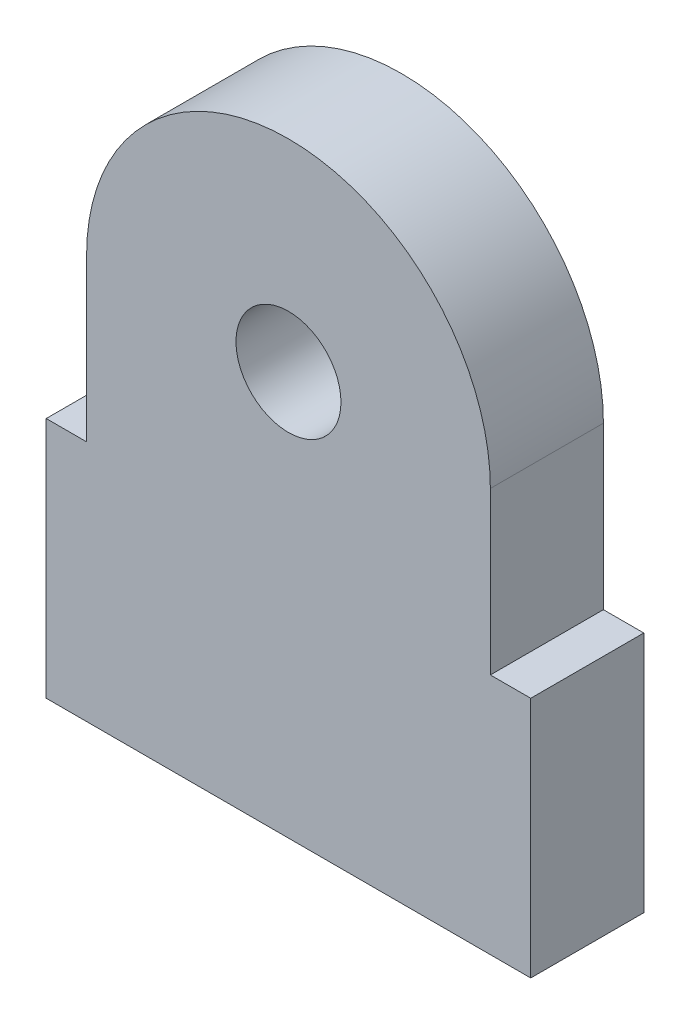
ISO-10303-21;
HEADER;
FILE_DESCRIPTION(('STEP AP214'),'2;1');
FILE_NAME('part.step','',(''),(''),'','','');
FILE_SCHEMA(('AUTOMOTIVE_DESIGN { 1 0 10303 214 1 1 1 1 }'));
ENDSEC;
DATA;
#1=APPLICATION_CONTEXT('core data for automotive mechanical design processes');
#2=APPLICATION_PROTOCOL_DEFINITION('international standard','automotive_design',2000,#1);
#3=PRODUCT_CONTEXT('',#1,'mechanical');
#4=PRODUCT('Part','Part','',(#3));
#5=PRODUCT_RELATED_PRODUCT_CATEGORY('part','',(#4));
#6=PRODUCT_DEFINITION_FORMATION('','',#4);
#7=PRODUCT_DEFINITION_CONTEXT('part definition',#1,'design');
#8=PRODUCT_DEFINITION('design','',#6,#7);
#9=PRODUCT_DEFINITION_SHAPE('','',#8);
#10=(LENGTH_UNIT() NAMED_UNIT(*) SI_UNIT(.MILLI.,.METRE.));
#11=(NAMED_UNIT(*) PLANE_ANGLE_UNIT() SI_UNIT($,.RADIAN.));
#12=(NAMED_UNIT(*) SI_UNIT($,.STERADIAN.) SOLID_ANGLE_UNIT());
#13=UNCERTAINTY_MEASURE_WITH_UNIT(LENGTH_MEASURE(1.E-05),#10,'distance_accuracy_value','');
#14=(GEOMETRIC_REPRESENTATION_CONTEXT(3) GLOBAL_UNCERTAINTY_ASSIGNED_CONTEXT((#13)) GLOBAL_UNIT_ASSIGNED_CONTEXT((#10,
#11,#12)) REPRESENTATION_CONTEXT('',''));
#15=CARTESIAN_POINT('',(0.,0.,0.));
#16=DIRECTION('',(0.,0.,1.));
#17=DIRECTION('',(1.,0.,0.));
#18=AXIS2_PLACEMENT_3D('',#15,#16,#17);
#19=CARTESIAN_POINT('',(-15.,-10.,7.));
#20=DIRECTION('',(0.,-1.,0.));
#21=DIRECTION('',(1.,0.,0.));
#22=AXIS2_PLACEMENT_3D('',#19,#20,#21);
#23=PLANE('',#22);
#24=DIRECTION('',(-1.,0.,0.));
#25=VECTOR('',#24,1.);
#26=CARTESIAN_POINT('',(-15.,-10.,0.));
#27=LINE('',#26,#25);
#28=CARTESIAN_POINT('',(-12.5,-10.,0.));
#29=VERTEX_POINT('',#28);
#30=CARTESIAN_POINT('',(-15.,-10.,0.));
#31=VERTEX_POINT('',#30);
#32=EDGE_CURVE('E129',#29,#31,#27,.T.);
#33=ORIENTED_EDGE('',*,*,#32,.T.);
#34=DIRECTION('',(0.,0.,-1.));
#35=VECTOR('',#34,1.);
#36=CARTESIAN_POINT('',(-15.,-10.,7.));
#37=LINE('',#36,#35);
#38=CARTESIAN_POINT('',(-15.,-10.,7.));
#39=VERTEX_POINT('',#38);
#40=EDGE_CURVE('E11',#39,#31,#37,.T.);
#41=ORIENTED_EDGE('',*,*,#40,.F.);
#42=DIRECTION('',(-1.,0.,0.));
#43=VECTOR('',#42,1.);
#44=CARTESIAN_POINT('',(-15.,-10.,7.));
#45=LINE('',#44,#43);
#46=CARTESIAN_POINT('',(-12.5,-10.,7.));
#47=VERTEX_POINT('',#46);
#48=EDGE_CURVE('E144',#47,#39,#45,.T.);
#49=ORIENTED_EDGE('',*,*,#48,.F.);
#50=DIRECTION('',(0.,0.,-1.));
#51=VECTOR('',#50,1.);
#52=CARTESIAN_POINT('',(-12.5,-10.,7.));
#53=LINE('',#52,#51);
#54=EDGE_CURVE('E125',#47,#29,#53,.T.);
#55=ORIENTED_EDGE('',*,*,#54,.T.);
#56=EDGE_LOOP('',(#33,#41,#49,#55));
#57=FACE_BOUND('',#56,.T.);
#58=ADVANCED_FACE('F33',(#57),#23,.F.);
#59=CARTESIAN_POINT('',(-15.,-10.,7.));
#60=DIRECTION('',(1.,0.,0.));
#61=DIRECTION('',(0.,1.,0.));
#62=AXIS2_PLACEMENT_3D('',#59,#60,#61);
#63=PLANE('',#62);
#64=DIRECTION('',(0.,-1.,0.));
#65=VECTOR('',#64,1.);
#66=CARTESIAN_POINT('',(-15.,-10.,0.));
#67=LINE('',#66,#65);
#68=CARTESIAN_POINT('',(-15.,-25.,0.));
#69=VERTEX_POINT('',#68);
#70=EDGE_CURVE('E132',#31,#69,#67,.T.);
#71=ORIENTED_EDGE('',*,*,#70,.T.);
#72=DIRECTION('',(0.,0.,-1.));
#73=VECTOR('',#72,1.);
#74=CARTESIAN_POINT('',(-15.,-25.,7.));
#75=LINE('',#74,#73);
#76=CARTESIAN_POINT('',(-15.,-25.,7.));
#77=VERTEX_POINT('',#76);
#78=EDGE_CURVE('E41',#77,#69,#75,.T.);
#79=ORIENTED_EDGE('',*,*,#78,.F.);
#80=DIRECTION('',(0.,-1.,0.));
#81=VECTOR('',#80,1.);
#82=CARTESIAN_POINT('',(-15.,-10.,7.));
#83=LINE('',#82,#81);
#84=EDGE_CURVE('E92',#39,#77,#83,.T.);
#85=ORIENTED_EDGE('',*,*,#84,.F.);
#86=ORIENTED_EDGE('',*,*,#40,.T.);
#87=EDGE_LOOP('',(#71,#79,#85,#86));
#88=FACE_BOUND('',#87,.T.);
#89=ADVANCED_FACE('F200',(#88),#63,.F.);
#90=CARTESIAN_POINT('',(-15.,-25.,7.));
#91=DIRECTION('',(0.,1.,0.));
#92=DIRECTION('',(0.,0.,1.));
#93=AXIS2_PLACEMENT_3D('',#90,#91,#92);
#94=PLANE('',#93);
#95=DIRECTION('',(1.,0.,0.));
#96=VECTOR('',#95,1.);
#97=CARTESIAN_POINT('',(-15.,-25.,0.));
#98=LINE('',#97,#96);
#99=CARTESIAN_POINT('',(15.,-25.,0.));
#100=VERTEX_POINT('',#99);
#101=EDGE_CURVE('E135',#69,#100,#98,.T.);
#102=ORIENTED_EDGE('',*,*,#101,.T.);
#103=DIRECTION('',(0.,0.,-1.));
#104=VECTOR('',#103,1.);
#105=CARTESIAN_POINT('',(15.,-25.,7.));
#106=LINE('',#105,#104);
#107=CARTESIAN_POINT('',(15.,-25.,7.));
#108=VERTEX_POINT('',#107);
#109=EDGE_CURVE('E151',#108,#100,#106,.T.);
#110=ORIENTED_EDGE('',*,*,#109,.F.);
#111=DIRECTION('',(1.,0.,0.));
#112=VECTOR('',#111,1.);
#113=CARTESIAN_POINT('',(-15.,-25.,7.));
#114=LINE('',#113,#112);
#115=EDGE_CURVE('E159',#77,#108,#114,.T.);
#116=ORIENTED_EDGE('',*,*,#115,.F.);
#117=ORIENTED_EDGE('',*,*,#78,.T.);
#118=EDGE_LOOP('',(#102,#110,#116,#117));
#119=FACE_BOUND('',#118,.T.);
#120=ADVANCED_FACE('F157',(#119),#94,.F.);
#121=CARTESIAN_POINT('',(15.,-10.,7.));
#122=DIRECTION('',(-1.,0.,0.));
#123=DIRECTION('',(0.,-1.,0.));
#124=AXIS2_PLACEMENT_3D('',#121,#122,#123);
#125=PLANE('',#124);
#126=DIRECTION('',(0.,1.,0.));
#127=VECTOR('',#126,1.);
#128=CARTESIAN_POINT('',(15.,-10.,0.));
#129=LINE('',#128,#127);
#130=CARTESIAN_POINT('',(15.,-10.,0.));
#131=VERTEX_POINT('',#130);
#132=EDGE_CURVE('E137',#100,#131,#129,.T.);
#133=ORIENTED_EDGE('',*,*,#132,.T.);
#134=DIRECTION('',(0.,0.,-1.));
#135=VECTOR('',#134,1.);
#136=CARTESIAN_POINT('',(15.,-10.,7.));
#137=LINE('',#136,#135);
#138=CARTESIAN_POINT('',(15.,-10.,7.));
#139=VERTEX_POINT('',#138);
#140=EDGE_CURVE('E148',#139,#131,#137,.T.);
#141=ORIENTED_EDGE('',*,*,#140,.F.);
#142=DIRECTION('',(0.,1.,0.));
#143=VECTOR('',#142,1.);
#144=CARTESIAN_POINT('',(15.,-10.,7.));
#145=LINE('',#144,#143);
#146=EDGE_CURVE('E171',#108,#139,#145,.T.);
#147=ORIENTED_EDGE('',*,*,#146,.F.);
#148=ORIENTED_EDGE('',*,*,#109,.T.);
#149=EDGE_LOOP('',(#133,#141,#147,#148));
#150=FACE_BOUND('',#149,.T.);
#151=ADVANCED_FACE('F167',(#150),#125,.F.);
#152=CARTESIAN_POINT('',(12.5,-10.,7.));
#153=DIRECTION('',(0.,-1.,0.));
#154=DIRECTION('',(1.,0.,0.));
#155=AXIS2_PLACEMENT_3D('',#152,#153,#154);
#156=PLANE('',#155);
#157=DIRECTION('',(-1.,0.,0.));
#158=VECTOR('',#157,1.);
#159=CARTESIAN_POINT('',(12.5,-10.,0.));
#160=LINE('',#159,#158);
#161=CARTESIAN_POINT('',(12.5,-10.,0.));
#162=VERTEX_POINT('',#161);
#163=EDGE_CURVE('E139',#131,#162,#160,.T.);
#164=ORIENTED_EDGE('',*,*,#163,.T.);
#165=DIRECTION('',(0.,0.,-1.));
#166=VECTOR('',#165,1.);
#167=CARTESIAN_POINT('',(12.5,-10.,7.));
#168=LINE('',#167,#166);
#169=CARTESIAN_POINT('',(12.5,-10.,7.));
#170=VERTEX_POINT('',#169);
#171=EDGE_CURVE('E120',#170,#162,#168,.T.);
#172=ORIENTED_EDGE('',*,*,#171,.F.);
#173=DIRECTION('',(-1.,0.,0.));
#174=VECTOR('',#173,1.);
#175=CARTESIAN_POINT('',(12.5,-10.,7.));
#176=LINE('',#175,#174);
#177=EDGE_CURVE('E111',#139,#170,#176,.T.);
#178=ORIENTED_EDGE('',*,*,#177,.F.);
#179=ORIENTED_EDGE('',*,*,#140,.T.);
#180=EDGE_LOOP('',(#164,#172,#178,#179));
#181=FACE_BOUND('',#180,.T.);
#182=ADVANCED_FACE('F170',(#181),#156,.F.);
#183=CARTESIAN_POINT('',(12.5,0.,7.));
#184=DIRECTION('',(-1.,0.,0.));
#185=DIRECTION('',(0.,0.,1.));
#186=AXIS2_PLACEMENT_3D('',#183,#184,#185);
#187=PLANE('',#186);
#188=DIRECTION('',(0.,1.,0.));
#189=VECTOR('',#188,1.);
#190=CARTESIAN_POINT('',(12.5,0.,0.));
#191=LINE('',#190,#189);
#192=CARTESIAN_POINT('',(12.5,0.,0.));
#193=VERTEX_POINT('',#192);
#194=EDGE_CURVE('E119',#162,#193,#191,.T.);
#195=ORIENTED_EDGE('',*,*,#194,.T.);
#196=DIRECTION('',(0.,0.,-1.));
#197=VECTOR('',#196,1.);
#198=CARTESIAN_POINT('',(12.5,0.,7.));
#199=LINE('',#198,#197);
#200=CARTESIAN_POINT('',(12.5,0.,7.));
#201=VERTEX_POINT('',#200);
#202=EDGE_CURVE('E116',#201,#193,#199,.T.);
#203=ORIENTED_EDGE('',*,*,#202,.F.);
#204=DIRECTION('',(0.,1.,0.));
#205=VECTOR('',#204,1.);
#206=CARTESIAN_POINT('',(12.5,0.,7.));
#207=LINE('',#206,#205);
#208=EDGE_CURVE('E105',#170,#201,#207,.T.);
#209=ORIENTED_EDGE('',*,*,#208,.F.);
#210=ORIENTED_EDGE('',*,*,#171,.T.);
#211=EDGE_LOOP('',(#195,#203,#209,#210));
#212=FACE_BOUND('',#211,.T.);
#213=ADVANCED_FACE('F117',(#212),#187,.F.);
#214=CARTESIAN_POINT('',(0.,0.,7.));
#215=DIRECTION('',(0.,0.,-1.));
#216=DIRECTION('',(-1.,0.,0.));
#217=AXIS2_PLACEMENT_3D('',#214,#215,#216);
#218=CYLINDRICAL_SURFACE('',#217,12.5);
#219=CARTESIAN_POINT('',(0.,0.,0.));
#220=DIRECTION('',(0.,0.,1.));
#221=DIRECTION('',(1.,0.,0.));
#222=AXIS2_PLACEMENT_3D('',#219,#220,#221);
#223=CIRCLE('',#222,12.5);
#224=CARTESIAN_POINT('',(-12.5,0.,0.));
#225=VERTEX_POINT('',#224);
#226=EDGE_CURVE('E78',#193,#225,#223,.T.);
#227=ORIENTED_EDGE('',*,*,#226,.T.);
#228=DIRECTION('',(0.,0.,-1.));
#229=VECTOR('',#228,1.);
#230=CARTESIAN_POINT('',(-12.5,0.,7.));
#231=LINE('',#230,#229);
#232=CARTESIAN_POINT('',(-12.5,0.,7.));
#233=VERTEX_POINT('',#232);
#234=EDGE_CURVE('E121',#233,#225,#231,.T.);
#235=ORIENTED_EDGE('',*,*,#234,.F.);
#236=CARTESIAN_POINT('',(0.,0.,7.));
#237=DIRECTION('',(0.,0.,1.));
#238=DIRECTION('',(1.,0.,0.));
#239=AXIS2_PLACEMENT_3D('',#236,#237,#238);
#240=CIRCLE('',#239,12.5);
#241=EDGE_CURVE('E109',#201,#233,#240,.T.);
#242=ORIENTED_EDGE('',*,*,#241,.F.);
#243=ORIENTED_EDGE('',*,*,#202,.T.);
#244=EDGE_LOOP('',(#227,#235,#242,#243));
#245=FACE_BOUND('',#244,.T.);
#246=ADVANCED_FACE('F123',(#245),#218,.T.);
#247=CARTESIAN_POINT('',(-12.5,0.,7.));
#248=DIRECTION('',(1.,0.,0.));
#249=DIRECTION('',(0.,0.,-1.));
#250=AXIS2_PLACEMENT_3D('',#247,#248,#249);
#251=PLANE('',#250);
#252=DIRECTION('',(0.,-1.,0.));
#253=VECTOR('',#252,1.);
#254=CARTESIAN_POINT('',(-12.5,0.,0.));
#255=LINE('',#254,#253);
#256=EDGE_CURVE('E84',#225,#29,#255,.T.);
#257=ORIENTED_EDGE('',*,*,#256,.T.);
#258=ORIENTED_EDGE('',*,*,#54,.F.);
#259=DIRECTION('',(0.,-1.,0.));
#260=VECTOR('',#259,1.);
#261=CARTESIAN_POINT('',(-12.5,0.,7.));
#262=LINE('',#261,#260);
#263=EDGE_CURVE('E49',#233,#47,#262,.T.);
#264=ORIENTED_EDGE('',*,*,#263,.F.);
#265=ORIENTED_EDGE('',*,*,#234,.T.);
#266=EDGE_LOOP('',(#257,#258,#264,#265));
#267=FACE_BOUND('',#266,.T.);
#268=ADVANCED_FACE('F191',(#267),#251,.F.);
#269=CARTESIAN_POINT('',(0.,0.,7.));
#270=DIRECTION('',(0.,0.,1.));
#271=DIRECTION('',(1.,0.,0.));
#272=AXIS2_PLACEMENT_3D('',#269,#270,#271);
#273=PLANE('',#272);
#274=CARTESIAN_POINT('',(0.,0.,7.));
#275=DIRECTION('',(0.,0.,1.));
#276=DIRECTION('',(1.,0.,0.));
#277=AXIS2_PLACEMENT_3D('',#274,#275,#276);
#278=CIRCLE('',#277,3.25);
#279=CARTESIAN_POINT('',(3.25,0.,7.));
#280=VERTEX_POINT('',#279);
#281=EDGE_CURVE('E177',#280,#280,#278,.T.);
#282=ORIENTED_EDGE('',*,*,#281,.F.);
#283=EDGE_LOOP('',(#282));
#284=FACE_BOUND('',#283,.T.);
#285=ORIENTED_EDGE('',*,*,#48,.T.);
#286=ORIENTED_EDGE('',*,*,#84,.T.);
#287=ORIENTED_EDGE('',*,*,#115,.T.);
#288=ORIENTED_EDGE('',*,*,#146,.T.);
#289=ORIENTED_EDGE('',*,*,#177,.T.);
#290=ORIENTED_EDGE('',*,*,#208,.T.);
#291=ORIENTED_EDGE('',*,*,#241,.T.);
#292=ORIENTED_EDGE('',*,*,#263,.T.);
#293=EDGE_LOOP('',(#285,#286,#287,#288,#289,#290,#291,#292));
#294=FACE_BOUND('',#293,.T.);
#295=ADVANCED_FACE('F107',(#284,#294),#273,.T.);
#296=CARTESIAN_POINT('',(0.,0.,0.));
#297=DIRECTION('',(0.,0.,1.));
#298=DIRECTION('',(1.,0.,0.));
#299=AXIS2_PLACEMENT_3D('',#296,#297,#298);
#300=PLANE('',#299);
#301=CARTESIAN_POINT('',(0.,0.,0.));
#302=DIRECTION('',(0.,0.,1.));
#303=DIRECTION('',(1.,0.,0.));
#304=AXIS2_PLACEMENT_3D('',#301,#302,#303);
#305=CIRCLE('',#304,3.25);
#306=CARTESIAN_POINT('',(3.25,0.,0.));
#307=VERTEX_POINT('',#306);
#308=EDGE_CURVE('E133',#307,#307,#305,.T.);
#309=ORIENTED_EDGE('',*,*,#308,.T.);
#310=EDGE_LOOP('',(#309));
#311=FACE_BOUND('',#310,.T.);
#312=ORIENTED_EDGE('',*,*,#32,.F.);
#313=ORIENTED_EDGE('',*,*,#256,.F.);
#314=ORIENTED_EDGE('',*,*,#226,.F.);
#315=ORIENTED_EDGE('',*,*,#194,.F.);
#316=ORIENTED_EDGE('',*,*,#163,.F.);
#317=ORIENTED_EDGE('',*,*,#132,.F.);
#318=ORIENTED_EDGE('',*,*,#101,.F.);
#319=ORIENTED_EDGE('',*,*,#70,.F.);
#320=EDGE_LOOP('',(#312,#313,#314,#315,#316,#317,#318,#319));
#321=FACE_BOUND('',#320,.T.);
#322=ADVANCED_FACE('F163',(#311,#321),#300,.F.);
#323=CARTESIAN_POINT('',(0.,0.,0.));
#324=DIRECTION('',(0.,0.,1.));
#325=DIRECTION('',(1.,0.,0.));
#326=AXIS2_PLACEMENT_3D('',#323,#324,#325);
#327=CYLINDRICAL_SURFACE('',#326,3.25);
#328=ORIENTED_EDGE('',*,*,#308,.F.);
#329=EDGE_LOOP('',(#328));
#330=FACE_BOUND('',#329,.T.);
#331=ORIENTED_EDGE('',*,*,#281,.T.);
#332=EDGE_LOOP('',(#331));
#333=FACE_BOUND('',#332,.T.);
#334=ADVANCED_FACE('F184',(#330,#333),#327,.F.);
#335=CLOSED_SHELL('',(#58,#89,#120,#151,#182,#213,#246,#268,#295,#322,#334));
#336=MANIFOLD_SOLID_BREP('B2',#335);
#337=ADVANCED_BREP_SHAPE_REPRESENTATION('',(#18,#336),#14);
#338=SHAPE_DEFINITION_REPRESENTATION(#9,#337);
ENDSEC;
END-ISO-10303-21;
